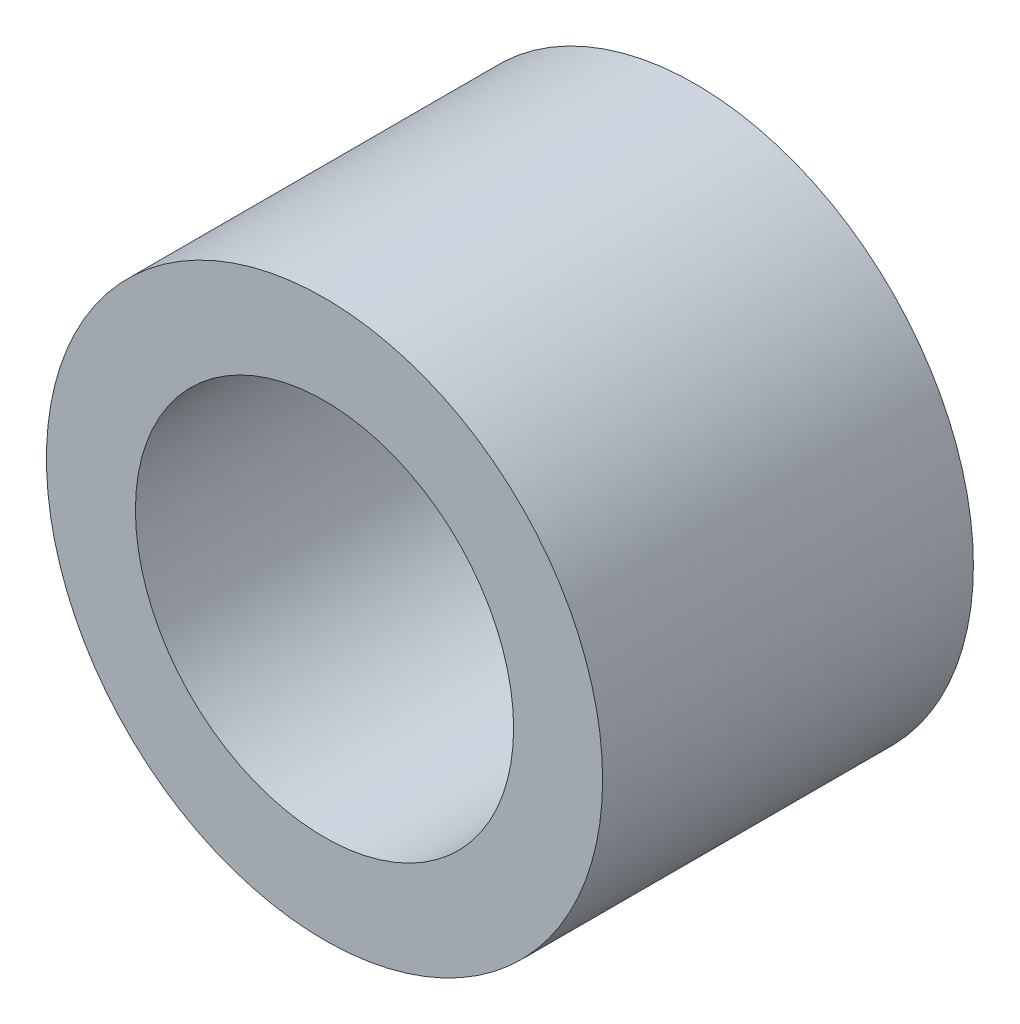
ISO-10303-21;
HEADER;
FILE_DESCRIPTION(('STEP AP214'),'2;1');
FILE_NAME('part.step','',(''),(''),'','','');
FILE_SCHEMA(('AUTOMOTIVE_DESIGN { 1 0 10303 214 1 1 1 1 }'));
ENDSEC;
DATA;
#1=APPLICATION_CONTEXT('core data for automotive mechanical design processes');
#2=APPLICATION_PROTOCOL_DEFINITION('international standard','automotive_design',2000,#1);
#3=PRODUCT_CONTEXT('',#1,'mechanical');
#4=PRODUCT('Part','Part','',(#3));
#5=PRODUCT_RELATED_PRODUCT_CATEGORY('part','',(#4));
#6=PRODUCT_DEFINITION_FORMATION('','',#4);
#7=PRODUCT_DEFINITION_CONTEXT('part definition',#1,'design');
#8=PRODUCT_DEFINITION('design','',#6,#7);
#9=PRODUCT_DEFINITION_SHAPE('','',#8);
#10=(LENGTH_UNIT() NAMED_UNIT(*) SI_UNIT(.MILLI.,.METRE.));
#11=(NAMED_UNIT(*) PLANE_ANGLE_UNIT() SI_UNIT($,.RADIAN.));
#12=(NAMED_UNIT(*) SI_UNIT($,.STERADIAN.) SOLID_ANGLE_UNIT());
#13=UNCERTAINTY_MEASURE_WITH_UNIT(LENGTH_MEASURE(1.E-05),#10,'distance_accuracy_value','');
#14=(GEOMETRIC_REPRESENTATION_CONTEXT(3) GLOBAL_UNCERTAINTY_ASSIGNED_CONTEXT((#13)) GLOBAL_UNIT_ASSIGNED_CONTEXT((#10,
#11,#12)) REPRESENTATION_CONTEXT('',''));
#15=CARTESIAN_POINT('',(0.,0.,0.));
#16=DIRECTION('',(0.,0.,1.));
#17=DIRECTION('',(1.,0.,0.));
#18=AXIS2_PLACEMENT_3D('',#15,#16,#17);
#19=CARTESIAN_POINT('',(0.,0.,10.));
#20=DIRECTION('',(0.,0.,1.));
#21=DIRECTION('',(1.,0.,0.));
#22=AXIS2_PLACEMENT_3D('',#19,#20,#21);
#23=PLANE('',#22);
#24=CARTESIAN_POINT('',(0.,0.,10.));
#25=DIRECTION('',(0.,0.,1.));
#26=DIRECTION('',(1.,0.,0.));
#27=AXIS2_PLACEMENT_3D('',#24,#25,#26);
#28=CIRCLE('',#27,15.);
#29=CARTESIAN_POINT('',(15.,0.,10.));
#30=VERTEX_POINT('',#29);
#31=EDGE_CURVE('E10',#30,#30,#28,.T.);
#32=ORIENTED_EDGE('',*,*,#31,.T.);
#33=EDGE_LOOP('',(#32));
#34=FACE_BOUND('',#33,.T.);
#35=CARTESIAN_POINT('',(0.,0.,10.));
#36=DIRECTION('',(0.,0.,1.));
#37=DIRECTION('',(1.,0.,0.));
#38=AXIS2_PLACEMENT_3D('',#35,#36,#37);
#39=CIRCLE('',#38,10.2);
#40=CARTESIAN_POINT('',(10.2,0.,10.));
#41=VERTEX_POINT('',#40);
#42=EDGE_CURVE('E49',#41,#41,#39,.T.);
#43=ORIENTED_EDGE('',*,*,#42,.F.);
#44=EDGE_LOOP('',(#43));
#45=FACE_BOUND('',#44,.T.);
#46=ADVANCED_FACE('F39',(#34,#45),#23,.T.);
#47=CARTESIAN_POINT('',(0.,0.,-10.));
#48=DIRECTION('',(0.,0.,1.));
#49=DIRECTION('',(1.,0.,0.));
#50=AXIS2_PLACEMENT_3D('',#47,#48,#49);
#51=PLANE('',#50);
#52=CARTESIAN_POINT('',(0.,0.,-10.));
#53=DIRECTION('',(0.,0.,1.));
#54=DIRECTION('',(1.,0.,0.));
#55=AXIS2_PLACEMENT_3D('',#52,#53,#54);
#56=CIRCLE('',#55,15.);
#57=CARTESIAN_POINT('',(15.,0.,-10.));
#58=VERTEX_POINT('',#57);
#59=EDGE_CURVE('E43',#58,#58,#56,.T.);
#60=ORIENTED_EDGE('',*,*,#59,.F.);
#61=EDGE_LOOP('',(#60));
#62=FACE_BOUND('',#61,.T.);
#63=CARTESIAN_POINT('',(0.,0.,-10.));
#64=DIRECTION('',(0.,0.,1.));
#65=DIRECTION('',(1.,0.,0.));
#66=AXIS2_PLACEMENT_3D('',#63,#64,#65);
#67=CIRCLE('',#66,10.2);
#68=CARTESIAN_POINT('',(10.2,0.,-10.));
#69=VERTEX_POINT('',#68);
#70=EDGE_CURVE('E55',#69,#69,#67,.T.);
#71=ORIENTED_EDGE('',*,*,#70,.T.);
#72=EDGE_LOOP('',(#71));
#73=FACE_BOUND('',#72,.T.);
#74=ADVANCED_FACE('F65',(#62,#73),#51,.F.);
#75=CARTESIAN_POINT('',(0.,0.,10.));
#76=DIRECTION('',(0.,0.,-1.));
#77=DIRECTION('',(-1.,0.,0.));
#78=AXIS2_PLACEMENT_3D('',#75,#76,#77);
#79=CYLINDRICAL_SURFACE('',#78,15.);
#80=ORIENTED_EDGE('',*,*,#31,.F.);
#81=EDGE_LOOP('',(#80));
#82=FACE_BOUND('',#81,.T.);
#83=ORIENTED_EDGE('',*,*,#59,.T.);
#84=EDGE_LOOP('',(#83));
#85=FACE_BOUND('',#84,.T.);
#86=ADVANCED_FACE('F41',(#82,#85),#79,.T.);
#87=CARTESIAN_POINT('',(0.,0.,10.));
#88=DIRECTION('',(0.,0.,-1.));
#89=DIRECTION('',(-1.,0.,0.));
#90=AXIS2_PLACEMENT_3D('',#87,#88,#89);
#91=CYLINDRICAL_SURFACE('',#90,10.2);
#92=ORIENTED_EDGE('',*,*,#42,.T.);
#93=EDGE_LOOP('',(#92));
#94=FACE_BOUND('',#93,.T.);
#95=ORIENTED_EDGE('',*,*,#70,.F.);
#96=EDGE_LOOP('',(#95));
#97=FACE_BOUND('',#96,.T.);
#98=ADVANCED_FACE('F59',(#94,#97),#91,.F.);
#99=CLOSED_SHELL('',(#46,#74,#86,#98));
#100=MANIFOLD_SOLID_BREP('B2',#99);
#101=ADVANCED_BREP_SHAPE_REPRESENTATION('',(#18,#100),#14);
#102=SHAPE_DEFINITION_REPRESENTATION(#9,#101);
ENDSEC;
END-ISO-10303-21;
